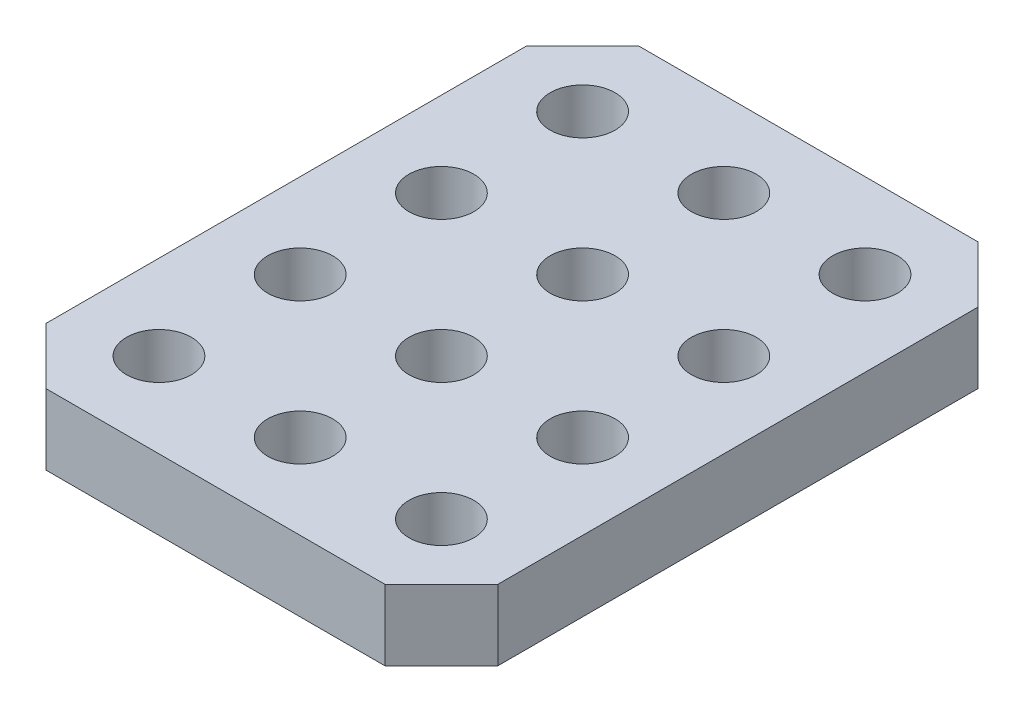
ISO-10303-21;
HEADER;
FILE_DESCRIPTION(('STEP AP214'),'2;1');
FILE_NAME('part.step','',(''),(''),'','','');
FILE_SCHEMA(('AUTOMOTIVE_DESIGN { 1 0 10303 214 1 1 1 1 }'));
ENDSEC;
DATA;
#1=APPLICATION_CONTEXT('core data for automotive mechanical design processes');
#2=APPLICATION_PROTOCOL_DEFINITION('international standard','automotive_design',2000,#1);
#3=PRODUCT_CONTEXT('',#1,'mechanical');
#4=PRODUCT('Part','Part','',(#3));
#5=PRODUCT_RELATED_PRODUCT_CATEGORY('part','',(#4));
#6=PRODUCT_DEFINITION_FORMATION('','',#4);
#7=PRODUCT_DEFINITION_CONTEXT('part definition',#1,'design');
#8=PRODUCT_DEFINITION('design','',#6,#7);
#9=PRODUCT_DEFINITION_SHAPE('','',#8);
#10=(LENGTH_UNIT() NAMED_UNIT(*) SI_UNIT(.MILLI.,.METRE.));
#11=(NAMED_UNIT(*) PLANE_ANGLE_UNIT() SI_UNIT($,.RADIAN.));
#12=(NAMED_UNIT(*) SI_UNIT($,.STERADIAN.) SOLID_ANGLE_UNIT());
#13=UNCERTAINTY_MEASURE_WITH_UNIT(LENGTH_MEASURE(1.E-05),#10,'distance_accuracy_value','');
#14=(GEOMETRIC_REPRESENTATION_CONTEXT(3) GLOBAL_UNCERTAINTY_ASSIGNED_CONTEXT((#13)) GLOBAL_UNIT_ASSIGNED_CONTEXT((#10,
#11,#12)) REPRESENTATION_CONTEXT('',''));
#15=CARTESIAN_POINT('',(0.,0.,0.));
#16=DIRECTION('',(0.,0.,1.));
#17=DIRECTION('',(1.,0.,0.));
#18=AXIS2_PLACEMENT_3D('',#15,#16,#17);
#19=CARTESIAN_POINT('',(0.,6.35,0.));
#20=DIRECTION('',(0.,-1.,0.));
#21=DIRECTION('',(0.,0.,-1.));
#22=AXIS2_PLACEMENT_3D('',#19,#20,#21);
#23=PLANE('',#22);
#24=DIRECTION('',(0.,0.,1.));
#25=VECTOR('',#24,1.);
#26=CARTESIAN_POINT('',(0.,6.35,-5.08));
#27=LINE('',#26,#25);
#28=CARTESIAN_POINT('',(0.,6.35,-48.26));
#29=VERTEX_POINT('',#28);
#30=CARTESIAN_POINT('',(0.,6.35,-5.08));
#31=VERTEX_POINT('',#30);
#32=EDGE_CURVE('E164',#29,#31,#27,.T.);
#33=ORIENTED_EDGE('',*,*,#32,.T.);
#34=DIRECTION('',(0.707106781186548,0.,0.707106781186548));
#35=VECTOR('',#34,1.);
#36=CARTESIAN_POINT('',(0.,6.35,-5.08));
#37=LINE('',#36,#35);
#38=CARTESIAN_POINT('',(5.08,6.35,0.));
#39=VERTEX_POINT('',#38);
#40=EDGE_CURVE('E100',#31,#39,#37,.T.);
#41=ORIENTED_EDGE('',*,*,#40,.T.);
#42=DIRECTION('',(1.,0.,0.));
#43=VECTOR('',#42,1.);
#44=CARTESIAN_POINT('',(5.08,6.35,0.));
#45=LINE('',#44,#43);
#46=CARTESIAN_POINT('',(35.56,6.35,0.));
#47=VERTEX_POINT('',#46);
#48=EDGE_CURVE('E185',#39,#47,#45,.T.);
#49=ORIENTED_EDGE('',*,*,#48,.T.);
#50=DIRECTION('',(0.707106781186548,0.,-0.707106781186547));
#51=VECTOR('',#50,1.);
#52=CARTESIAN_POINT('',(35.56,6.35,0.));
#53=LINE('',#52,#51);
#54=CARTESIAN_POINT('',(40.64,6.35,-5.08));
#55=VERTEX_POINT('',#54);
#56=EDGE_CURVE('E199',#47,#55,#53,.T.);
#57=ORIENTED_EDGE('',*,*,#56,.T.);
#58=DIRECTION('',(0.,0.,-1.));
#59=VECTOR('',#58,1.);
#60=CARTESIAN_POINT('',(40.64,6.35,-5.08));
#61=LINE('',#60,#59);
#62=CARTESIAN_POINT('',(40.64,6.35,-48.26));
#63=VERTEX_POINT('',#62);
#64=EDGE_CURVE('E119',#55,#63,#61,.T.);
#65=ORIENTED_EDGE('',*,*,#64,.T.);
#66=DIRECTION('',(-0.707106781186548,0.,-0.707106781186548));
#67=VECTOR('',#66,1.);
#68=CARTESIAN_POINT('',(35.56,6.35,-53.34));
#69=LINE('',#68,#67);
#70=CARTESIAN_POINT('',(35.56,6.35,-53.34));
#71=VERTEX_POINT('',#70);
#72=EDGE_CURVE('E113',#63,#71,#69,.T.);
#73=ORIENTED_EDGE('',*,*,#72,.T.);
#74=DIRECTION('',(-1.,0.,0.));
#75=VECTOR('',#74,1.);
#76=CARTESIAN_POINT('',(5.08,6.35,-53.34));
#77=LINE('',#76,#75);
#78=CARTESIAN_POINT('',(5.08,6.35,-53.34));
#79=VERTEX_POINT('',#78);
#80=EDGE_CURVE('E117',#71,#79,#77,.T.);
#81=ORIENTED_EDGE('',*,*,#80,.T.);
#82=DIRECTION('',(-0.707106781186547,0.,0.707106781186548));
#83=VECTOR('',#82,1.);
#84=CARTESIAN_POINT('',(0.,6.35,-48.26));
#85=LINE('',#84,#83);
#86=EDGE_CURVE('E57',#79,#29,#85,.T.);
#87=ORIENTED_EDGE('',*,*,#86,.T.);
#88=EDGE_LOOP('',(#33,#41,#49,#57,#65,#73,#81,#87));
#89=FACE_BOUND('',#88,.T.);
#90=CARTESIAN_POINT('',(7.62,6.35,-7.62));
#91=DIRECTION('',(0.,1.,0.));
#92=DIRECTION('',(0.,0.,1.));
#93=AXIS2_PLACEMENT_3D('',#90,#91,#92);
#94=CIRCLE('',#93,2.921);
#95=CARTESIAN_POINT('',(7.62,6.35,-4.699));
#96=VERTEX_POINT('',#95);
#97=EDGE_CURVE('E146',#96,#96,#94,.T.);
#98=ORIENTED_EDGE('',*,*,#97,.F.);
#99=EDGE_LOOP('',(#98));
#100=FACE_BOUND('',#99,.T.);
#101=CARTESIAN_POINT('',(20.32,6.35,-7.62));
#102=DIRECTION('',(0.,1.,0.));
#103=DIRECTION('',(0.,0.,1.));
#104=AXIS2_PLACEMENT_3D('',#101,#102,#103);
#105=CIRCLE('',#104,2.921);
#106=CARTESIAN_POINT('',(20.32,6.35,-4.699));
#107=VERTEX_POINT('',#106);
#108=EDGE_CURVE('E213',#107,#107,#105,.T.);
#109=ORIENTED_EDGE('',*,*,#108,.F.);
#110=EDGE_LOOP('',(#109));
#111=FACE_BOUND('',#110,.T.);
#112=CARTESIAN_POINT('',(33.02,6.35,-7.62));
#113=DIRECTION('',(0.,1.,0.));
#114=DIRECTION('',(0.,0.,1.));
#115=AXIS2_PLACEMENT_3D('',#112,#113,#114);
#116=CIRCLE('',#115,2.921);
#117=CARTESIAN_POINT('',(33.02,6.35,-4.69899999999999));
#118=VERTEX_POINT('',#117);
#119=EDGE_CURVE('E221',#118,#118,#116,.T.);
#120=ORIENTED_EDGE('',*,*,#119,.F.);
#121=EDGE_LOOP('',(#120));
#122=FACE_BOUND('',#121,.T.);
#123=CARTESIAN_POINT('',(20.32,6.35,-20.32));
#124=DIRECTION('',(0.,1.,0.));
#125=DIRECTION('',(0.,0.,1.));
#126=AXIS2_PLACEMENT_3D('',#123,#124,#125);
#127=CIRCLE('',#126,2.921);
#128=CARTESIAN_POINT('',(20.32,6.35,-17.399));
#129=VERTEX_POINT('',#128);
#130=EDGE_CURVE('E229',#129,#129,#127,.T.);
#131=ORIENTED_EDGE('',*,*,#130,.F.);
#132=EDGE_LOOP('',(#131));
#133=FACE_BOUND('',#132,.T.);
#134=CARTESIAN_POINT('',(33.0199999999999,6.35,-20.32));
#135=DIRECTION('',(0.,1.,0.));
#136=DIRECTION('',(0.,0.,1.));
#137=AXIS2_PLACEMENT_3D('',#134,#135,#136);
#138=CIRCLE('',#137,2.921);
#139=CARTESIAN_POINT('',(33.0199999999999,6.35,-17.399));
#140=VERTEX_POINT('',#139);
#141=EDGE_CURVE('E237',#140,#140,#138,.T.);
#142=ORIENTED_EDGE('',*,*,#141,.F.);
#143=EDGE_LOOP('',(#142));
#144=FACE_BOUND('',#143,.T.);
#145=CARTESIAN_POINT('',(20.3199999999999,6.35,-33.02));
#146=DIRECTION('',(0.,1.,0.));
#147=DIRECTION('',(0.,0.,1.));
#148=AXIS2_PLACEMENT_3D('',#145,#146,#147);
#149=CIRCLE('',#148,2.921);
#150=CARTESIAN_POINT('',(20.3199999999999,6.35,-30.099));
#151=VERTEX_POINT('',#150);
#152=EDGE_CURVE('E245',#151,#151,#149,.T.);
#153=ORIENTED_EDGE('',*,*,#152,.F.);
#154=EDGE_LOOP('',(#153));
#155=FACE_BOUND('',#154,.T.);
#156=CARTESIAN_POINT('',(33.0199999999999,6.35,-33.02));
#157=DIRECTION('',(0.,1.,0.));
#158=DIRECTION('',(0.,0.,1.));
#159=AXIS2_PLACEMENT_3D('',#156,#157,#158);
#160=CIRCLE('',#159,2.921);
#161=CARTESIAN_POINT('',(33.0199999999999,6.35,-30.099));
#162=VERTEX_POINT('',#161);
#163=EDGE_CURVE('E253',#162,#162,#160,.T.);
#164=ORIENTED_EDGE('',*,*,#163,.F.);
#165=EDGE_LOOP('',(#164));
#166=FACE_BOUND('',#165,.T.);
#167=CARTESIAN_POINT('',(20.3199999999999,6.35,-45.72));
#168=DIRECTION('',(0.,1.,0.));
#169=DIRECTION('',(0.,0.,1.));
#170=AXIS2_PLACEMENT_3D('',#167,#168,#169);
#171=CIRCLE('',#170,2.921);
#172=CARTESIAN_POINT('',(20.3199999999999,6.35,-42.799));
#173=VERTEX_POINT('',#172);
#174=EDGE_CURVE('E261',#173,#173,#171,.T.);
#175=ORIENTED_EDGE('',*,*,#174,.F.);
#176=EDGE_LOOP('',(#175));
#177=FACE_BOUND('',#176,.T.);
#178=CARTESIAN_POINT('',(33.0199999999999,6.35,-45.72));
#179=DIRECTION('',(0.,1.,0.));
#180=DIRECTION('',(0.,0.,1.));
#181=AXIS2_PLACEMENT_3D('',#178,#179,#180);
#182=CIRCLE('',#181,2.92099999999999);
#183=CARTESIAN_POINT('',(33.0199999999999,6.35,-42.799));
#184=VERTEX_POINT('',#183);
#185=EDGE_CURVE('E269',#184,#184,#182,.T.);
#186=ORIENTED_EDGE('',*,*,#185,.F.);
#187=EDGE_LOOP('',(#186));
#188=FACE_BOUND('',#187,.T.);
#189=CARTESIAN_POINT('',(7.61999999999996,6.35,-20.32));
#190=DIRECTION('',(0.,1.,0.));
#191=DIRECTION('',(0.,0.,1.));
#192=AXIS2_PLACEMENT_3D('',#189,#190,#191);
#193=CIRCLE('',#192,2.921);
#194=CARTESIAN_POINT('',(7.61999999999996,6.35,-17.399));
#195=VERTEX_POINT('',#194);
#196=EDGE_CURVE('E277',#195,#195,#193,.T.);
#197=ORIENTED_EDGE('',*,*,#196,.F.);
#198=EDGE_LOOP('',(#197));
#199=FACE_BOUND('',#198,.T.);
#200=CARTESIAN_POINT('',(7.61999999999991,6.35,-33.02));
#201=DIRECTION('',(0.,1.,0.));
#202=DIRECTION('',(0.,0.,1.));
#203=AXIS2_PLACEMENT_3D('',#200,#201,#202);
#204=CIRCLE('',#203,2.921);
#205=CARTESIAN_POINT('',(7.61999999999991,6.35,-30.099));
#206=VERTEX_POINT('',#205);
#207=EDGE_CURVE('E285',#206,#206,#204,.T.);
#208=ORIENTED_EDGE('',*,*,#207,.F.);
#209=EDGE_LOOP('',(#208));
#210=FACE_BOUND('',#209,.T.);
#211=CARTESIAN_POINT('',(7.61999999999987,6.35,-45.72));
#212=DIRECTION('',(0.,1.,0.));
#213=DIRECTION('',(0.,0.,1.));
#214=AXIS2_PLACEMENT_3D('',#211,#212,#213);
#215=CIRCLE('',#214,2.921);
#216=CARTESIAN_POINT('',(7.61999999999987,6.35,-42.799));
#217=VERTEX_POINT('',#216);
#218=EDGE_CURVE('E293',#217,#217,#215,.T.);
#219=ORIENTED_EDGE('',*,*,#218,.F.);
#220=EDGE_LOOP('',(#219));
#221=FACE_BOUND('',#220,.T.);
#222=ADVANCED_FACE('F39',(#89,#100,#111,#122,#133,#144,#155,#166,#177,#188,#199,#210,#221),#23,.F.);
#223=CARTESIAN_POINT('',(0.,0.,0.));
#224=DIRECTION('',(0.,-1.,0.));
#225=DIRECTION('',(0.,0.,-1.));
#226=AXIS2_PLACEMENT_3D('',#223,#224,#225);
#227=PLANE('',#226);
#228=CARTESIAN_POINT('',(7.61999999999991,0.,-33.02));
#229=DIRECTION('',(0.,1.,0.));
#230=DIRECTION('',(0.,0.,1.));
#231=AXIS2_PLACEMENT_3D('',#228,#229,#230);
#232=CIRCLE('',#231,2.921);
#233=CARTESIAN_POINT('',(7.61999999999991,0.,-30.099));
#234=VERTEX_POINT('',#233);
#235=EDGE_CURVE('E289',#234,#234,#232,.T.);
#236=ORIENTED_EDGE('',*,*,#235,.T.);
#237=EDGE_LOOP('',(#236));
#238=FACE_BOUND('',#237,.T.);
#239=CARTESIAN_POINT('',(33.0199999999999,0.,-45.72));
#240=DIRECTION('',(0.,1.,0.));
#241=DIRECTION('',(0.,0.,1.));
#242=AXIS2_PLACEMENT_3D('',#239,#240,#241);
#243=CIRCLE('',#242,2.92099999999999);
#244=CARTESIAN_POINT('',(33.0199999999999,0.,-42.799));
#245=VERTEX_POINT('',#244);
#246=EDGE_CURVE('E273',#245,#245,#243,.T.);
#247=ORIENTED_EDGE('',*,*,#246,.T.);
#248=EDGE_LOOP('',(#247));
#249=FACE_BOUND('',#248,.T.);
#250=CARTESIAN_POINT('',(33.0199999999999,0.,-33.02));
#251=DIRECTION('',(0.,1.,0.));
#252=DIRECTION('',(0.,0.,1.));
#253=AXIS2_PLACEMENT_3D('',#250,#251,#252);
#254=CIRCLE('',#253,2.921);
#255=CARTESIAN_POINT('',(33.0199999999999,0.,-30.099));
#256=VERTEX_POINT('',#255);
#257=EDGE_CURVE('E257',#256,#256,#254,.T.);
#258=ORIENTED_EDGE('',*,*,#257,.T.);
#259=EDGE_LOOP('',(#258));
#260=FACE_BOUND('',#259,.T.);
#261=CARTESIAN_POINT('',(33.0199999999999,0.,-20.32));
#262=DIRECTION('',(0.,1.,0.));
#263=DIRECTION('',(0.,0.,1.));
#264=AXIS2_PLACEMENT_3D('',#261,#262,#263);
#265=CIRCLE('',#264,2.921);
#266=CARTESIAN_POINT('',(33.0199999999999,0.,-17.399));
#267=VERTEX_POINT('',#266);
#268=EDGE_CURVE('E241',#267,#267,#265,.T.);
#269=ORIENTED_EDGE('',*,*,#268,.T.);
#270=EDGE_LOOP('',(#269));
#271=FACE_BOUND('',#270,.T.);
#272=CARTESIAN_POINT('',(33.02,0.,-7.62));
#273=DIRECTION('',(0.,1.,0.));
#274=DIRECTION('',(0.,0.,1.));
#275=AXIS2_PLACEMENT_3D('',#272,#273,#274);
#276=CIRCLE('',#275,2.921);
#277=CARTESIAN_POINT('',(33.02,0.,-4.69899999999999));
#278=VERTEX_POINT('',#277);
#279=EDGE_CURVE('E225',#278,#278,#276,.T.);
#280=ORIENTED_EDGE('',*,*,#279,.T.);
#281=EDGE_LOOP('',(#280));
#282=FACE_BOUND('',#281,.T.);
#283=CARTESIAN_POINT('',(7.62,0.,-7.62));
#284=DIRECTION('',(0.,1.,0.));
#285=DIRECTION('',(0.,0.,1.));
#286=AXIS2_PLACEMENT_3D('',#283,#284,#285);
#287=CIRCLE('',#286,2.921);
#288=CARTESIAN_POINT('',(7.62,0.,-4.699));
#289=VERTEX_POINT('',#288);
#290=EDGE_CURVE('E209',#289,#289,#287,.T.);
#291=ORIENTED_EDGE('',*,*,#290,.T.);
#292=EDGE_LOOP('',(#291));
#293=FACE_BOUND('',#292,.T.);
#294=DIRECTION('',(0.,0.,1.));
#295=VECTOR('',#294,1.);
#296=CARTESIAN_POINT('',(0.,0.,-5.08));
#297=LINE('',#296,#295);
#298=CARTESIAN_POINT('',(0.,0.,-48.26));
#299=VERTEX_POINT('',#298);
#300=CARTESIAN_POINT('',(0.,0.,-5.08));
#301=VERTEX_POINT('',#300);
#302=EDGE_CURVE('E141',#299,#301,#297,.T.);
#303=ORIENTED_EDGE('',*,*,#302,.F.);
#304=DIRECTION('',(-0.707106781186547,0.,0.707106781186548));
#305=VECTOR('',#304,1.);
#306=CARTESIAN_POINT('',(0.,0.,-48.26));
#307=LINE('',#306,#305);
#308=CARTESIAN_POINT('',(5.08,0.,-53.34));
#309=VERTEX_POINT('',#308);
#310=EDGE_CURVE('E92',#309,#299,#307,.T.);
#311=ORIENTED_EDGE('',*,*,#310,.F.);
#312=DIRECTION('',(-1.,0.,0.));
#313=VECTOR('',#312,1.);
#314=CARTESIAN_POINT('',(5.08,0.,-53.34));
#315=LINE('',#314,#313);
#316=CARTESIAN_POINT('',(35.56,0.,-53.34));
#317=VERTEX_POINT('',#316);
#318=EDGE_CURVE('E86',#317,#309,#315,.T.);
#319=ORIENTED_EDGE('',*,*,#318,.F.);
#320=DIRECTION('',(-0.707106781186548,0.,-0.707106781186548));
#321=VECTOR('',#320,1.);
#322=CARTESIAN_POINT('',(35.56,0.,-53.34));
#323=LINE('',#322,#321);
#324=CARTESIAN_POINT('',(40.64,0.,-48.26));
#325=VERTEX_POINT('',#324);
#326=EDGE_CURVE('E128',#325,#317,#323,.T.);
#327=ORIENTED_EDGE('',*,*,#326,.F.);
#328=DIRECTION('',(0.,0.,-1.));
#329=VECTOR('',#328,1.);
#330=CARTESIAN_POINT('',(40.64,0.,-5.08));
#331=LINE('',#330,#329);
#332=CARTESIAN_POINT('',(40.64,0.,-5.08));
#333=VERTEX_POINT('',#332);
#334=EDGE_CURVE('E155',#333,#325,#331,.T.);
#335=ORIENTED_EDGE('',*,*,#334,.F.);
#336=DIRECTION('',(0.707106781186548,0.,-0.707106781186547));
#337=VECTOR('',#336,1.);
#338=CARTESIAN_POINT('',(35.56,0.,0.));
#339=LINE('',#338,#337);
#340=CARTESIAN_POINT('',(35.56,0.,0.));
#341=VERTEX_POINT('',#340);
#342=EDGE_CURVE('E152',#341,#333,#339,.T.);
#343=ORIENTED_EDGE('',*,*,#342,.F.);
#344=DIRECTION('',(1.,0.,0.));
#345=VECTOR('',#344,1.);
#346=CARTESIAN_POINT('',(5.08,0.,0.));
#347=LINE('',#346,#345);
#348=CARTESIAN_POINT('',(5.08,0.,0.));
#349=VERTEX_POINT('',#348);
#350=EDGE_CURVE('E149',#349,#341,#347,.T.);
#351=ORIENTED_EDGE('',*,*,#350,.F.);
#352=DIRECTION('',(0.707106781186548,0.,0.707106781186548));
#353=VECTOR('',#352,1.);
#354=CARTESIAN_POINT('',(0.,0.,-5.08));
#355=LINE('',#354,#353);
#356=EDGE_CURVE('E145',#301,#349,#355,.T.);
#357=ORIENTED_EDGE('',*,*,#356,.F.);
#358=EDGE_LOOP('',(#303,#311,#319,#327,#335,#343,#351,#357));
#359=FACE_BOUND('',#358,.T.);
#360=CARTESIAN_POINT('',(20.32,0.,-7.62));
#361=DIRECTION('',(0.,1.,0.));
#362=DIRECTION('',(0.,0.,1.));
#363=AXIS2_PLACEMENT_3D('',#360,#361,#362);
#364=CIRCLE('',#363,2.921);
#365=CARTESIAN_POINT('',(20.32,0.,-4.699));
#366=VERTEX_POINT('',#365);
#367=EDGE_CURVE('E217',#366,#366,#364,.T.);
#368=ORIENTED_EDGE('',*,*,#367,.T.);
#369=EDGE_LOOP('',(#368));
#370=FACE_BOUND('',#369,.T.);
#371=CARTESIAN_POINT('',(20.32,0.,-20.32));
#372=DIRECTION('',(0.,1.,0.));
#373=DIRECTION('',(0.,0.,1.));
#374=AXIS2_PLACEMENT_3D('',#371,#372,#373);
#375=CIRCLE('',#374,2.921);
#376=CARTESIAN_POINT('',(20.32,0.,-17.399));
#377=VERTEX_POINT('',#376);
#378=EDGE_CURVE('E233',#377,#377,#375,.T.);
#379=ORIENTED_EDGE('',*,*,#378,.T.);
#380=EDGE_LOOP('',(#379));
#381=FACE_BOUND('',#380,.T.);
#382=CARTESIAN_POINT('',(20.3199999999999,0.,-33.02));
#383=DIRECTION('',(0.,1.,0.));
#384=DIRECTION('',(0.,0.,1.));
#385=AXIS2_PLACEMENT_3D('',#382,#383,#384);
#386=CIRCLE('',#385,2.921);
#387=CARTESIAN_POINT('',(20.3199999999999,0.,-30.099));
#388=VERTEX_POINT('',#387);
#389=EDGE_CURVE('E249',#388,#388,#386,.T.);
#390=ORIENTED_EDGE('',*,*,#389,.T.);
#391=EDGE_LOOP('',(#390));
#392=FACE_BOUND('',#391,.T.);
#393=CARTESIAN_POINT('',(20.3199999999999,0.,-45.72));
#394=DIRECTION('',(0.,1.,0.));
#395=DIRECTION('',(0.,0.,1.));
#396=AXIS2_PLACEMENT_3D('',#393,#394,#395);
#397=CIRCLE('',#396,2.921);
#398=CARTESIAN_POINT('',(20.3199999999999,0.,-42.799));
#399=VERTEX_POINT('',#398);
#400=EDGE_CURVE('E265',#399,#399,#397,.T.);
#401=ORIENTED_EDGE('',*,*,#400,.T.);
#402=EDGE_LOOP('',(#401));
#403=FACE_BOUND('',#402,.T.);
#404=CARTESIAN_POINT('',(7.61999999999996,0.,-20.32));
#405=DIRECTION('',(0.,1.,0.));
#406=DIRECTION('',(0.,0.,1.));
#407=AXIS2_PLACEMENT_3D('',#404,#405,#406);
#408=CIRCLE('',#407,2.921);
#409=CARTESIAN_POINT('',(7.61999999999996,0.,-17.399));
#410=VERTEX_POINT('',#409);
#411=EDGE_CURVE('E281',#410,#410,#408,.T.);
#412=ORIENTED_EDGE('',*,*,#411,.T.);
#413=EDGE_LOOP('',(#412));
#414=FACE_BOUND('',#413,.T.);
#415=CARTESIAN_POINT('',(7.61999999999987,0.,-45.72));
#416=DIRECTION('',(0.,1.,0.));
#417=DIRECTION('',(0.,0.,1.));
#418=AXIS2_PLACEMENT_3D('',#415,#416,#417);
#419=CIRCLE('',#418,2.921);
#420=CARTESIAN_POINT('',(7.61999999999987,0.,-42.799));
#421=VERTEX_POINT('',#420);
#422=EDGE_CURVE('E297',#421,#421,#419,.T.);
#423=ORIENTED_EDGE('',*,*,#422,.T.);
#424=EDGE_LOOP('',(#423));
#425=FACE_BOUND('',#424,.T.);
#426=ADVANCED_FACE('F189',(#238,#249,#260,#271,#282,#293,#359,#370,#381,#392,#403,#414,#425),
#227,.T.);
#427=CARTESIAN_POINT('',(0.,6.35,-5.08));
#428=DIRECTION('',(1.,0.,0.));
#429=DIRECTION('',(0.,0.,-1.));
#430=AXIS2_PLACEMENT_3D('',#427,#428,#429);
#431=PLANE('',#430);
#432=ORIENTED_EDGE('',*,*,#302,.T.);
#433=DIRECTION('',(0.,-1.,0.));
#434=VECTOR('',#433,1.);
#435=CARTESIAN_POINT('',(0.,6.35,-5.08));
#436=LINE('',#435,#434);
#437=EDGE_CURVE('E11',#31,#301,#436,.T.);
#438=ORIENTED_EDGE('',*,*,#437,.F.);
#439=ORIENTED_EDGE('',*,*,#32,.F.);
#440=DIRECTION('',(0.,-1.,0.));
#441=VECTOR('',#440,1.);
#442=CARTESIAN_POINT('',(0.,6.35,-48.26));
#443=LINE('',#442,#441);
#444=EDGE_CURVE('E137',#29,#299,#443,.T.);
#445=ORIENTED_EDGE('',*,*,#444,.T.);
#446=EDGE_LOOP('',(#432,#438,#439,#445));
#447=FACE_BOUND('',#446,.T.);
#448=ADVANCED_FACE('F41',(#447),#431,.F.);
#449=CARTESIAN_POINT('',(0.,6.35,-5.08));
#450=DIRECTION('',(0.707106781186548,0.,-0.707106781186548));
#451=DIRECTION('',(-0.707106781186548,0.,-0.707106781186548));
#452=AXIS2_PLACEMENT_3D('',#449,#450,#451);
#453=PLANE('',#452);
#454=ORIENTED_EDGE('',*,*,#356,.T.);
#455=DIRECTION('',(0.,-1.,0.));
#456=VECTOR('',#455,1.);
#457=CARTESIAN_POINT('',(5.08,6.35,0.));
#458=LINE('',#457,#456);
#459=EDGE_CURVE('E49',#39,#349,#458,.T.);
#460=ORIENTED_EDGE('',*,*,#459,.F.);
#461=ORIENTED_EDGE('',*,*,#40,.F.);
#462=ORIENTED_EDGE('',*,*,#437,.T.);
#463=EDGE_LOOP('',(#454,#460,#461,#462));
#464=FACE_BOUND('',#463,.T.);
#465=ADVANCED_FACE('F331',(#464),#453,.F.);
#466=CARTESIAN_POINT('',(5.08,6.35,0.));
#467=DIRECTION('',(0.,0.,-1.));
#468=DIRECTION('',(-1.,0.,0.));
#469=AXIS2_PLACEMENT_3D('',#466,#467,#468);
#470=PLANE('',#469);
#471=ORIENTED_EDGE('',*,*,#350,.T.);
#472=DIRECTION('',(0.,-1.,0.));
#473=VECTOR('',#472,1.);
#474=CARTESIAN_POINT('',(35.56,6.35,0.));
#475=LINE('',#474,#473);
#476=EDGE_CURVE('E175',#47,#341,#475,.T.);
#477=ORIENTED_EDGE('',*,*,#476,.F.);
#478=ORIENTED_EDGE('',*,*,#48,.F.);
#479=ORIENTED_EDGE('',*,*,#459,.T.);
#480=EDGE_LOOP('',(#471,#477,#478,#479));
#481=FACE_BOUND('',#480,.T.);
#482=ADVANCED_FACE('F183',(#481),#470,.F.);
#483=CARTESIAN_POINT('',(35.56,6.35,0.));
#484=DIRECTION('',(-0.707106781186547,0.,-0.707106781186548));
#485=DIRECTION('',(-0.707106781186548,0.,0.707106781186547));
#486=AXIS2_PLACEMENT_3D('',#483,#484,#485);
#487=PLANE('',#486);
#488=ORIENTED_EDGE('',*,*,#342,.T.);
#489=DIRECTION('',(0.,-1.,0.));
#490=VECTOR('',#489,1.);
#491=CARTESIAN_POINT('',(40.64,6.35,-5.08));
#492=LINE('',#491,#490);
#493=EDGE_CURVE('E171',#55,#333,#492,.T.);
#494=ORIENTED_EDGE('',*,*,#493,.F.);
#495=ORIENTED_EDGE('',*,*,#56,.F.);
#496=ORIENTED_EDGE('',*,*,#476,.T.);
#497=EDGE_LOOP('',(#488,#494,#495,#496));
#498=FACE_BOUND('',#497,.T.);
#499=ADVANCED_FACE('F194',(#498),#487,.F.);
#500=CARTESIAN_POINT('',(40.64,6.35,-5.08));
#501=DIRECTION('',(-1.,0.,0.));
#502=DIRECTION('',(0.,0.,1.));
#503=AXIS2_PLACEMENT_3D('',#500,#501,#502);
#504=PLANE('',#503);
#505=ORIENTED_EDGE('',*,*,#334,.T.);
#506=DIRECTION('',(0.,-1.,0.));
#507=VECTOR('',#506,1.);
#508=CARTESIAN_POINT('',(40.64,6.35,-48.26));
#509=LINE('',#508,#507);
#510=EDGE_CURVE('E130',#63,#325,#509,.T.);
#511=ORIENTED_EDGE('',*,*,#510,.F.);
#512=ORIENTED_EDGE('',*,*,#64,.F.);
#513=ORIENTED_EDGE('',*,*,#493,.T.);
#514=EDGE_LOOP('',(#505,#511,#512,#513));
#515=FACE_BOUND('',#514,.T.);
#516=ADVANCED_FACE('F197',(#515),#504,.F.);
#517=CARTESIAN_POINT('',(35.56,6.35,-53.34));
#518=DIRECTION('',(-0.707106781186548,0.,0.707106781186548));
#519=DIRECTION('',(0.707106781186548,0.,0.707106781186548));
#520=AXIS2_PLACEMENT_3D('',#517,#518,#519);
#521=PLANE('',#520);
#522=ORIENTED_EDGE('',*,*,#326,.T.);
#523=DIRECTION('',(0.,-1.,0.));
#524=VECTOR('',#523,1.);
#525=CARTESIAN_POINT('',(35.56,6.35,-53.34));
#526=LINE('',#525,#524);
#527=EDGE_CURVE('E125',#71,#317,#526,.T.);
#528=ORIENTED_EDGE('',*,*,#527,.F.);
#529=ORIENTED_EDGE('',*,*,#72,.F.);
#530=ORIENTED_EDGE('',*,*,#510,.T.);
#531=EDGE_LOOP('',(#522,#528,#529,#530));
#532=FACE_BOUND('',#531,.T.);
#533=ADVANCED_FACE('F126',(#532),#521,.F.);
#534=CARTESIAN_POINT('',(5.08,6.35,-53.34));
#535=DIRECTION('',(0.,0.,1.));
#536=DIRECTION('',(1.,0.,0.));
#537=AXIS2_PLACEMENT_3D('',#534,#535,#536);
#538=PLANE('',#537);
#539=ORIENTED_EDGE('',*,*,#318,.T.);
#540=DIRECTION('',(0.,-1.,0.));
#541=VECTOR('',#540,1.);
#542=CARTESIAN_POINT('',(5.08,6.35,-53.34));
#543=LINE('',#542,#541);
#544=EDGE_CURVE('E131',#79,#309,#543,.T.);
#545=ORIENTED_EDGE('',*,*,#544,.F.);
#546=ORIENTED_EDGE('',*,*,#80,.F.);
#547=ORIENTED_EDGE('',*,*,#527,.T.);
#548=EDGE_LOOP('',(#539,#545,#546,#547));
#549=FACE_BOUND('',#548,.T.);
#550=ADVANCED_FACE('F133',(#549),#538,.F.);
#551=CARTESIAN_POINT('',(0.,6.35,-48.26));
#552=DIRECTION('',(0.707106781186548,0.,0.707106781186547));
#553=DIRECTION('',(0.707106781186547,0.,-0.707106781186548));
#554=AXIS2_PLACEMENT_3D('',#551,#552,#553);
#555=PLANE('',#554);
#556=ORIENTED_EDGE('',*,*,#310,.T.);
#557=ORIENTED_EDGE('',*,*,#444,.F.);
#558=ORIENTED_EDGE('',*,*,#86,.F.);
#559=ORIENTED_EDGE('',*,*,#544,.T.);
#560=EDGE_LOOP('',(#556,#557,#558,#559));
#561=FACE_BOUND('',#560,.T.);
#562=ADVANCED_FACE('F319',(#561),#555,.F.);
#563=CARTESIAN_POINT('',(7.62,6.35,-7.62));
#564=DIRECTION('',(0.,-1.,0.));
#565=DIRECTION('',(0.,0.,-1.));
#566=AXIS2_PLACEMENT_3D('',#563,#564,#565);
#567=CYLINDRICAL_SURFACE('',#566,2.921);
#568=ORIENTED_EDGE('',*,*,#97,.T.);
#569=EDGE_LOOP('',(#568));
#570=FACE_BOUND('',#569,.T.);
#571=ORIENTED_EDGE('',*,*,#290,.F.);
#572=EDGE_LOOP('',(#571));
#573=FACE_BOUND('',#572,.T.);
#574=ADVANCED_FACE('F316',(#570,#573),#567,.F.);
#575=CARTESIAN_POINT('',(20.32,6.35,-7.62));
#576=DIRECTION('',(0.,-1.,0.));
#577=DIRECTION('',(0.,0.,-1.));
#578=AXIS2_PLACEMENT_3D('',#575,#576,#577);
#579=CYLINDRICAL_SURFACE('',#578,2.921);
#580=ORIENTED_EDGE('',*,*,#108,.T.);
#581=EDGE_LOOP('',(#580));
#582=FACE_BOUND('',#581,.T.);
#583=ORIENTED_EDGE('',*,*,#367,.F.);
#584=EDGE_LOOP('',(#583));
#585=FACE_BOUND('',#584,.T.);
#586=ADVANCED_FACE('F395',(#582,#585),#579,.F.);
#587=CARTESIAN_POINT('',(33.02,6.35,-7.62));
#588=DIRECTION('',(0.,-1.,0.));
#589=DIRECTION('',(0.,0.,-1.));
#590=AXIS2_PLACEMENT_3D('',#587,#588,#589);
#591=CYLINDRICAL_SURFACE('',#590,2.921);
#592=ORIENTED_EDGE('',*,*,#119,.T.);
#593=EDGE_LOOP('',(#592));
#594=FACE_BOUND('',#593,.T.);
#595=ORIENTED_EDGE('',*,*,#279,.F.);
#596=EDGE_LOOP('',(#595));
#597=FACE_BOUND('',#596,.T.);
#598=ADVANCED_FACE('F403',(#594,#597),#591,.F.);
#599=CARTESIAN_POINT('',(20.32,6.35,-20.32));
#600=DIRECTION('',(0.,-1.,0.));
#601=DIRECTION('',(0.,0.,-1.));
#602=AXIS2_PLACEMENT_3D('',#599,#600,#601);
#603=CYLINDRICAL_SURFACE('',#602,2.921);
#604=ORIENTED_EDGE('',*,*,#130,.T.);
#605=EDGE_LOOP('',(#604));
#606=FACE_BOUND('',#605,.T.);
#607=ORIENTED_EDGE('',*,*,#378,.F.);
#608=EDGE_LOOP('',(#607));
#609=FACE_BOUND('',#608,.T.);
#610=ADVANCED_FACE('F411',(#606,#609),#603,.F.);
#611=CARTESIAN_POINT('',(33.0199999999999,6.35,-20.32));
#612=DIRECTION('',(0.,-1.,0.));
#613=DIRECTION('',(0.,0.,-1.));
#614=AXIS2_PLACEMENT_3D('',#611,#612,#613);
#615=CYLINDRICAL_SURFACE('',#614,2.921);
#616=ORIENTED_EDGE('',*,*,#141,.T.);
#617=EDGE_LOOP('',(#616));
#618=FACE_BOUND('',#617,.T.);
#619=ORIENTED_EDGE('',*,*,#268,.F.);
#620=EDGE_LOOP('',(#619));
#621=FACE_BOUND('',#620,.T.);
#622=ADVANCED_FACE('F420',(#618,#621),#615,.F.);
#623=CARTESIAN_POINT('',(20.3199999999999,6.35,-33.02));
#624=DIRECTION('',(0.,-1.,0.));
#625=DIRECTION('',(0.,0.,-1.));
#626=AXIS2_PLACEMENT_3D('',#623,#624,#625);
#627=CYLINDRICAL_SURFACE('',#626,2.921);
#628=ORIENTED_EDGE('',*,*,#152,.T.);
#629=EDGE_LOOP('',(#628));
#630=FACE_BOUND('',#629,.T.);
#631=ORIENTED_EDGE('',*,*,#389,.F.);
#632=EDGE_LOOP('',(#631));
#633=FACE_BOUND('',#632,.T.);
#634=ADVANCED_FACE('F429',(#630,#633),#627,.F.);
#635=CARTESIAN_POINT('',(33.0199999999999,6.35,-33.02));
#636=DIRECTION('',(0.,-1.,0.));
#637=DIRECTION('',(0.,0.,-1.));
#638=AXIS2_PLACEMENT_3D('',#635,#636,#637);
#639=CYLINDRICAL_SURFACE('',#638,2.921);
#640=ORIENTED_EDGE('',*,*,#163,.T.);
#641=EDGE_LOOP('',(#640));
#642=FACE_BOUND('',#641,.T.);
#643=ORIENTED_EDGE('',*,*,#257,.F.);
#644=EDGE_LOOP('',(#643));
#645=FACE_BOUND('',#644,.T.);
#646=ADVANCED_FACE('F438',(#642,#645),#639,.F.);
#647=CARTESIAN_POINT('',(20.3199999999999,6.35,-45.72));
#648=DIRECTION('',(0.,-1.,0.));
#649=DIRECTION('',(0.,0.,-1.));
#650=AXIS2_PLACEMENT_3D('',#647,#648,#649);
#651=CYLINDRICAL_SURFACE('',#650,2.921);
#652=ORIENTED_EDGE('',*,*,#174,.T.);
#653=EDGE_LOOP('',(#652));
#654=FACE_BOUND('',#653,.T.);
#655=ORIENTED_EDGE('',*,*,#400,.F.);
#656=EDGE_LOOP('',(#655));
#657=FACE_BOUND('',#656,.T.);
#658=ADVANCED_FACE('F447',(#654,#657),#651,.F.);
#659=CARTESIAN_POINT('',(33.0199999999999,6.35,-45.72));
#660=DIRECTION('',(0.,-1.,0.));
#661=DIRECTION('',(0.,0.,-1.));
#662=AXIS2_PLACEMENT_3D('',#659,#660,#661);
#663=CYLINDRICAL_SURFACE('',#662,2.92099999999999);
#664=ORIENTED_EDGE('',*,*,#185,.T.);
#665=EDGE_LOOP('',(#664));
#666=FACE_BOUND('',#665,.T.);
#667=ORIENTED_EDGE('',*,*,#246,.F.);
#668=EDGE_LOOP('',(#667));
#669=FACE_BOUND('',#668,.T.);
#670=ADVANCED_FACE('F456',(#666,#669),#663,.F.);
#671=CARTESIAN_POINT('',(7.61999999999996,6.35,-20.32));
#672=DIRECTION('',(0.,-1.,0.));
#673=DIRECTION('',(0.,0.,-1.));
#674=AXIS2_PLACEMENT_3D('',#671,#672,#673);
#675=CYLINDRICAL_SURFACE('',#674,2.921);
#676=ORIENTED_EDGE('',*,*,#196,.T.);
#677=EDGE_LOOP('',(#676));
#678=FACE_BOUND('',#677,.T.);
#679=ORIENTED_EDGE('',*,*,#411,.F.);
#680=EDGE_LOOP('',(#679));
#681=FACE_BOUND('',#680,.T.);
#682=ADVANCED_FACE('F465',(#678,#681),#675,.F.);
#683=CARTESIAN_POINT('',(7.61999999999991,6.35,-33.02));
#684=DIRECTION('',(0.,-1.,0.));
#685=DIRECTION('',(0.,0.,-1.));
#686=AXIS2_PLACEMENT_3D('',#683,#684,#685);
#687=CYLINDRICAL_SURFACE('',#686,2.921);
#688=ORIENTED_EDGE('',*,*,#207,.T.);
#689=EDGE_LOOP('',(#688));
#690=FACE_BOUND('',#689,.T.);
#691=ORIENTED_EDGE('',*,*,#235,.F.);
#692=EDGE_LOOP('',(#691));
#693=FACE_BOUND('',#692,.T.);
#694=ADVANCED_FACE('F474',(#690,#693),#687,.F.);
#695=CARTESIAN_POINT('',(7.61999999999987,6.35,-45.72));
#696=DIRECTION('',(0.,-1.,0.));
#697=DIRECTION('',(0.,0.,-1.));
#698=AXIS2_PLACEMENT_3D('',#695,#696,#697);
#699=CYLINDRICAL_SURFACE('',#698,2.921);
#700=ORIENTED_EDGE('',*,*,#218,.T.);
#701=EDGE_LOOP('',(#700));
#702=FACE_BOUND('',#701,.T.);
#703=ORIENTED_EDGE('',*,*,#422,.F.);
#704=EDGE_LOOP('',(#703));
#705=FACE_BOUND('',#704,.T.);
#706=ADVANCED_FACE('F305',(#702,#705),#699,.F.);
#707=CLOSED_SHELL('',(#222,#426,#448,#465,#482,#499,#516,#533,#550,#562,#574,#586,#598,#610,
#622,#634,#646,#658,#670,#682,#694,#706));
#708=MANIFOLD_SOLID_BREP('B2',#707);
#709=ADVANCED_BREP_SHAPE_REPRESENTATION('',(#18,#708),#14);
#710=SHAPE_DEFINITION_REPRESENTATION(#9,#709);
ENDSEC;
END-ISO-10303-21;
